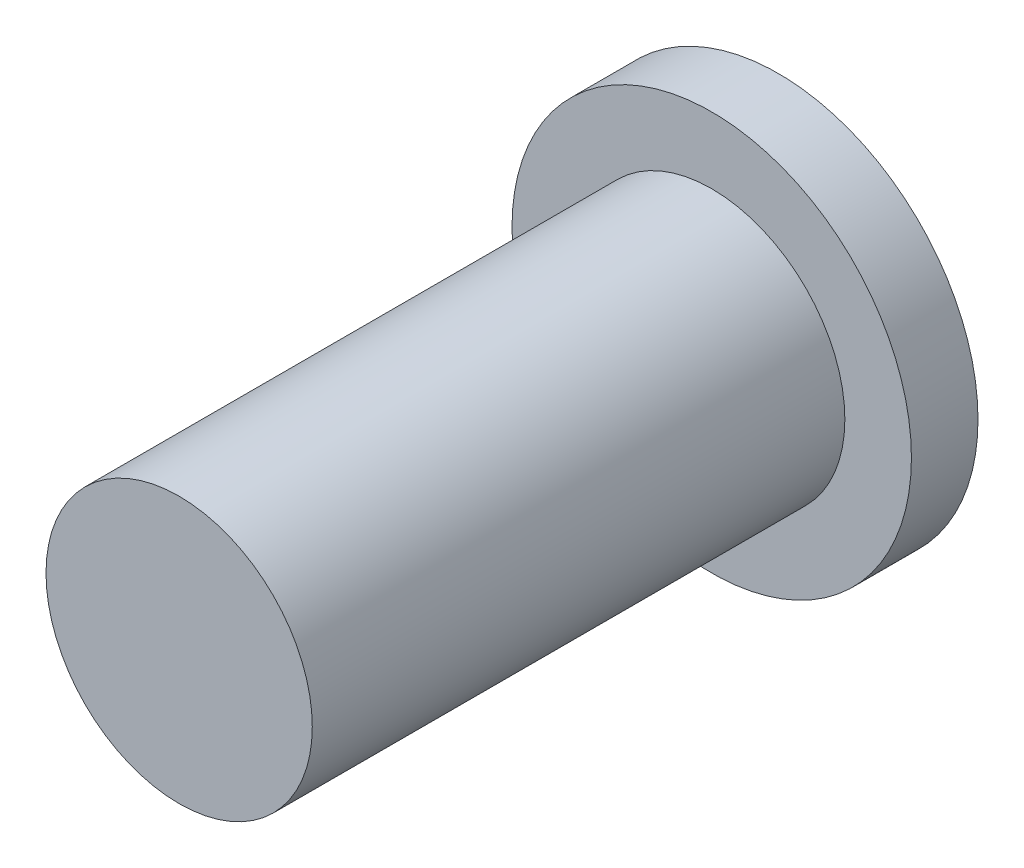
ISO-10303-21;
HEADER;
FILE_DESCRIPTION(('STEP AP214'),'2;1');
FILE_NAME('part.step','',(''),(''),'','','');
FILE_SCHEMA(('AUTOMOTIVE_DESIGN { 1 0 10303 214 1 1 1 1 }'));
ENDSEC;
DATA;
#1=APPLICATION_CONTEXT('core data for automotive mechanical design processes');
#2=APPLICATION_PROTOCOL_DEFINITION('international standard','automotive_design',2000,#1);
#3=PRODUCT_CONTEXT('',#1,'mechanical');
#4=PRODUCT('Part','Part','',(#3));
#5=PRODUCT_RELATED_PRODUCT_CATEGORY('part','',(#4));
#6=PRODUCT_DEFINITION_FORMATION('','',#4);
#7=PRODUCT_DEFINITION_CONTEXT('part definition',#1,'design');
#8=PRODUCT_DEFINITION('design','',#6,#7);
#9=PRODUCT_DEFINITION_SHAPE('','',#8);
#10=(LENGTH_UNIT() NAMED_UNIT(*) SI_UNIT(.MILLI.,.METRE.));
#11=(NAMED_UNIT(*) PLANE_ANGLE_UNIT() SI_UNIT($,.RADIAN.));
#12=(NAMED_UNIT(*) SI_UNIT($,.STERADIAN.) SOLID_ANGLE_UNIT());
#13=UNCERTAINTY_MEASURE_WITH_UNIT(LENGTH_MEASURE(1.E-05),#10,'distance_accuracy_value','');
#14=(GEOMETRIC_REPRESENTATION_CONTEXT(3) GLOBAL_UNCERTAINTY_ASSIGNED_CONTEXT((#13)) GLOBAL_UNIT_ASSIGNED_CONTEXT((#10,
#11,#12)) REPRESENTATION_CONTEXT('',''));
#15=CARTESIAN_POINT('',(0.,0.,0.));
#16=DIRECTION('',(0.,0.,1.));
#17=DIRECTION('',(1.,0.,0.));
#18=AXIS2_PLACEMENT_3D('',#15,#16,#17);
#19=CARTESIAN_POINT('',(0.,0.,1.27));
#20=DIRECTION('',(0.,0.,-1.));
#21=DIRECTION('',(-1.,0.,0.));
#22=AXIS2_PLACEMENT_3D('',#19,#20,#21);
#23=CYLINDRICAL_SURFACE('',#22,3.81);
#24=CARTESIAN_POINT('',(0.,0.,1.27));
#25=DIRECTION('',(0.,0.,1.));
#26=DIRECTION('',(1.,0.,0.));
#27=AXIS2_PLACEMENT_3D('',#24,#25,#26);
#28=CIRCLE('',#27,3.81);
#29=CARTESIAN_POINT('',(3.81,0.,1.27));
#30=VERTEX_POINT('',#29);
#31=EDGE_CURVE('E43',#30,#30,#28,.T.);
#32=ORIENTED_EDGE('',*,*,#31,.F.);
#33=EDGE_LOOP('',(#32));
#34=FACE_BOUND('',#33,.T.);
#35=CARTESIAN_POINT('',(0.,0.,0.));
#36=DIRECTION('',(0.,0.,1.));
#37=DIRECTION('',(1.,0.,0.));
#38=AXIS2_PLACEMENT_3D('',#35,#36,#37);
#39=CIRCLE('',#38,3.81);
#40=CARTESIAN_POINT('',(3.81,0.,0.));
#41=VERTEX_POINT('',#40);
#42=EDGE_CURVE('E38',#41,#41,#39,.T.);
#43=ORIENTED_EDGE('',*,*,#42,.T.);
#44=EDGE_LOOP('',(#43));
#45=FACE_BOUND('',#44,.T.);
#46=ADVANCED_FACE('F35',(#34,#45),#23,.T.);
#47=CARTESIAN_POINT('',(0.,0.,1.27));
#48=DIRECTION('',(0.,0.,1.));
#49=DIRECTION('',(1.,0.,0.));
#50=AXIS2_PLACEMENT_3D('',#47,#48,#49);
#51=PLANE('',#50);
#52=CARTESIAN_POINT('',(0.,0.,1.27));
#53=DIRECTION('',(0.,0.,1.));
#54=DIRECTION('',(1.,0.,0.));
#55=AXIS2_PLACEMENT_3D('',#52,#53,#54);
#56=CIRCLE('',#55,2.54);
#57=CARTESIAN_POINT('',(2.54,0.,1.27));
#58=VERTEX_POINT('',#57);
#59=EDGE_CURVE('E10',#58,#58,#56,.T.);
#60=ORIENTED_EDGE('',*,*,#59,.F.);
#61=EDGE_LOOP('',(#60));
#62=FACE_BOUND('',#61,.T.);
#63=ORIENTED_EDGE('',*,*,#31,.T.);
#64=EDGE_LOOP('',(#63));
#65=FACE_BOUND('',#64,.T.);
#66=ADVANCED_FACE('F63',(#62,#65),#51,.T.);
#67=CARTESIAN_POINT('',(0.,0.,0.));
#68=DIRECTION('',(0.,0.,1.));
#69=DIRECTION('',(1.,0.,0.));
#70=AXIS2_PLACEMENT_3D('',#67,#68,#69);
#71=PLANE('',#70);
#72=ORIENTED_EDGE('',*,*,#42,.F.);
#73=EDGE_LOOP('',(#72));
#74=FACE_BOUND('',#73,.T.);
#75=ADVANCED_FACE('F60',(#74),#71,.F.);
#76=CARTESIAN_POINT('',(0.,0.,11.43));
#77=DIRECTION('',(0.,0.,-1.));
#78=DIRECTION('',(-1.,0.,0.));
#79=AXIS2_PLACEMENT_3D('',#76,#77,#78);
#80=CYLINDRICAL_SURFACE('',#79,2.54);
#81=CARTESIAN_POINT('',(0.,0.,11.43));
#82=DIRECTION('',(0.,0.,1.));
#83=DIRECTION('',(1.,0.,0.));
#84=AXIS2_PLACEMENT_3D('',#81,#82,#83);
#85=CIRCLE('',#84,2.54);
#86=CARTESIAN_POINT('',(2.54,0.,11.43));
#87=VERTEX_POINT('',#86);
#88=EDGE_CURVE('E50',#87,#87,#85,.T.);
#89=ORIENTED_EDGE('',*,*,#88,.F.);
#90=EDGE_LOOP('',(#89));
#91=FACE_BOUND('',#90,.T.);
#92=ORIENTED_EDGE('',*,*,#59,.T.);
#93=EDGE_LOOP('',(#92));
#94=FACE_BOUND('',#93,.T.);
#95=ADVANCED_FACE('F62',(#91,#94),#80,.T.);
#96=CARTESIAN_POINT('',(0.,0.,11.43));
#97=DIRECTION('',(0.,0.,1.));
#98=DIRECTION('',(1.,0.,0.));
#99=AXIS2_PLACEMENT_3D('',#96,#97,#98);
#100=PLANE('',#99);
#101=ORIENTED_EDGE('',*,*,#88,.T.);
#102=EDGE_LOOP('',(#101));
#103=FACE_BOUND('',#102,.T.);
#104=ADVANCED_FACE('F68',(#103),#100,.T.);
#105=CLOSED_SHELL('',(#46,#66,#75,#95,#104));
#106=MANIFOLD_SOLID_BREP('B2',#105);
#107=ADVANCED_BREP_SHAPE_REPRESENTATION('',(#18,#106),#14);
#108=SHAPE_DEFINITION_REPRESENTATION(#9,#107);
ENDSEC;
END-ISO-10303-21;
